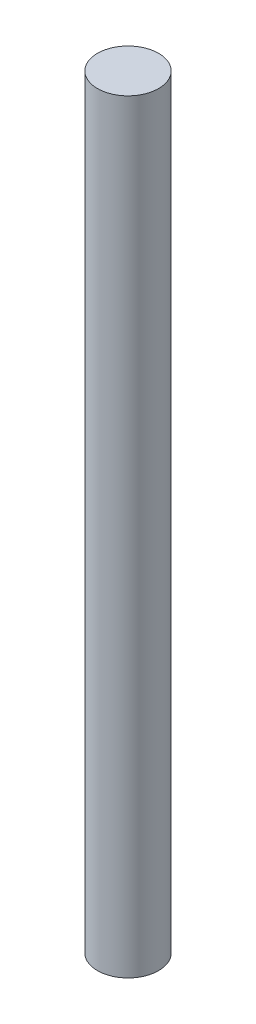
ISO-10303-21;
HEADER;
FILE_DESCRIPTION(('STEP AP214'),'2;1');
FILE_NAME('part.step','',(''),(''),'','','');
FILE_SCHEMA(('AUTOMOTIVE_DESIGN { 1 0 10303 214 1 1 1 1 }'));
ENDSEC;
DATA;
#1=APPLICATION_CONTEXT('core data for automotive mechanical design processes');
#2=APPLICATION_PROTOCOL_DEFINITION('international standard','automotive_design',2000,#1);
#3=PRODUCT_CONTEXT('',#1,'mechanical');
#4=PRODUCT('Part','Part','',(#3));
#5=PRODUCT_RELATED_PRODUCT_CATEGORY('part','',(#4));
#6=PRODUCT_DEFINITION_FORMATION('','',#4);
#7=PRODUCT_DEFINITION_CONTEXT('part definition',#1,'design');
#8=PRODUCT_DEFINITION('design','',#6,#7);
#9=PRODUCT_DEFINITION_SHAPE('','',#8);
#10=(LENGTH_UNIT() NAMED_UNIT(*) SI_UNIT(.MILLI.,.METRE.));
#11=(NAMED_UNIT(*) PLANE_ANGLE_UNIT() SI_UNIT($,.RADIAN.));
#12=(NAMED_UNIT(*) SI_UNIT($,.STERADIAN.) SOLID_ANGLE_UNIT());
#13=UNCERTAINTY_MEASURE_WITH_UNIT(LENGTH_MEASURE(1.E-05),#10,'distance_accuracy_value','');
#14=(GEOMETRIC_REPRESENTATION_CONTEXT(3) GLOBAL_UNCERTAINTY_ASSIGNED_CONTEXT((#13)) GLOBAL_UNIT_ASSIGNED_CONTEXT((#10,
#11,#12)) REPRESENTATION_CONTEXT('',''));
#15=CARTESIAN_POINT('',(0.,0.,0.));
#16=DIRECTION('',(0.,0.,1.));
#17=DIRECTION('',(1.,0.,0.));
#18=AXIS2_PLACEMENT_3D('',#15,#16,#17);
#19=CARTESIAN_POINT('',(0.,250.,0.));
#20=DIRECTION('',(0.,-1.,0.));
#21=DIRECTION('',(0.,0.,-1.));
#22=AXIS2_PLACEMENT_3D('',#19,#20,#21);
#23=PLANE('',#22);
#24=CARTESIAN_POINT('',(0.,250.,0.));
#25=DIRECTION('',(0.,-1.,0.));
#26=DIRECTION('',(0.,0.,-1.));
#27=AXIS2_PLACEMENT_3D('',#24,#25,#26);
#28=CIRCLE('',#27,10.);
#29=CARTESIAN_POINT('',(0.,250.,-10.));
#30=VERTEX_POINT('',#29);
#31=EDGE_CURVE('E11',#30,#30,#28,.T.);
#32=ORIENTED_EDGE('',*,*,#31,.F.);
#33=EDGE_LOOP('',(#32));
#34=FACE_BOUND('',#33,.T.);
#35=ADVANCED_FACE('F56',(#34),#23,.F.);
#36=CARTESIAN_POINT('',(0.,0.,0.));
#37=DIRECTION('',(0.,-1.,0.));
#38=DIRECTION('',(0.,0.,-1.));
#39=AXIS2_PLACEMENT_3D('',#36,#37,#38);
#40=CYLINDRICAL_SURFACE('',#39,10.);
#41=CARTESIAN_POINT('',(0.,0.,0.));
#42=DIRECTION('',(0.,-1.,0.));
#43=DIRECTION('',(0.,0.,-1.));
#44=AXIS2_PLACEMENT_3D('',#41,#42,#43);
#45=CIRCLE('',#44,10.);
#46=CARTESIAN_POINT('',(0.,0.,-10.));
#47=VERTEX_POINT('',#46);
#48=EDGE_CURVE('E67',#47,#47,#45,.T.);
#49=ORIENTED_EDGE('',*,*,#48,.F.);
#50=EDGE_LOOP('',(#49));
#51=FACE_BOUND('',#50,.T.);
#52=ORIENTED_EDGE('',*,*,#31,.T.);
#53=EDGE_LOOP('',(#52));
#54=FACE_BOUND('',#53,.T.);
#55=ADVANCED_FACE('F80',(#51,#54),#40,.T.);
#56=CARTESIAN_POINT('',(0.,0.,0.));
#57=DIRECTION('',(0.,1.,0.));
#58=DIRECTION('',(0.,0.,1.));
#59=AXIS2_PLACEMENT_3D('',#56,#57,#58);
#60=PLANE('',#59);
#61=ORIENTED_EDGE('',*,*,#48,.T.);
#62=EDGE_LOOP('',(#61));
#63=FACE_BOUND('',#62,.T.);
#64=ADVANCED_FACE('F77',(#63),#60,.F.);
#65=CLOSED_SHELL('',(#35,#55,#64));
#66=MANIFOLD_SOLID_BREP('B2',#65);
#67=ADVANCED_BREP_SHAPE_REPRESENTATION('',(#18,#66),#14);
#68=SHAPE_DEFINITION_REPRESENTATION(#9,#67);
ENDSEC;
END-ISO-10303-21;
